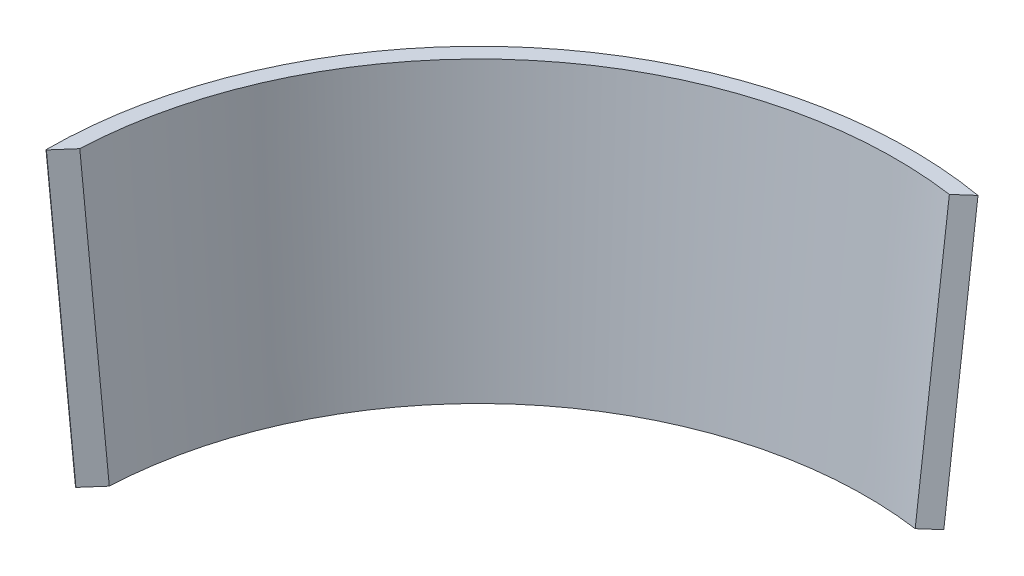
ISO-10303-21;
HEADER;
FILE_DESCRIPTION(('STEP AP214'),'2;1');
FILE_NAME('part.step','',(''),(''),'','','');
FILE_SCHEMA(('AUTOMOTIVE_DESIGN { 1 0 10303 214 1 1 1 1 }'));
ENDSEC;
DATA;
#1=APPLICATION_CONTEXT('core data for automotive mechanical design processes');
#2=APPLICATION_PROTOCOL_DEFINITION('international standard','automotive_design',2000,#1);
#3=PRODUCT_CONTEXT('',#1,'mechanical');
#4=PRODUCT('Part','Part','',(#3));
#5=PRODUCT_RELATED_PRODUCT_CATEGORY('part','',(#4));
#6=PRODUCT_DEFINITION_FORMATION('','',#4);
#7=PRODUCT_DEFINITION_CONTEXT('part definition',#1,'design');
#8=PRODUCT_DEFINITION('design','',#6,#7);
#9=PRODUCT_DEFINITION_SHAPE('','',#8);
#10=(LENGTH_UNIT() NAMED_UNIT(*) SI_UNIT(.MILLI.,.METRE.));
#11=(NAMED_UNIT(*) PLANE_ANGLE_UNIT() SI_UNIT($,.RADIAN.));
#12=(NAMED_UNIT(*) SI_UNIT($,.STERADIAN.) SOLID_ANGLE_UNIT());
#13=UNCERTAINTY_MEASURE_WITH_UNIT(LENGTH_MEASURE(1.E-05),#10,'distance_accuracy_value','');
#14=(GEOMETRIC_REPRESENTATION_CONTEXT(3) GLOBAL_UNCERTAINTY_ASSIGNED_CONTEXT((#13)) GLOBAL_UNIT_ASSIGNED_CONTEXT((#10,
#11,#12)) REPRESENTATION_CONTEXT('',''));
#15=CARTESIAN_POINT('',(0.,0.,0.));
#16=DIRECTION('',(0.,0.,1.));
#17=DIRECTION('',(1.,0.,0.));
#18=AXIS2_PLACEMENT_3D('',#15,#16,#17);
#19=CARTESIAN_POINT('',(4.84537136696433,17.899082056199,-27.4794665427604));
#20=DIRECTION('',(0.,-1.,0.));
#21=DIRECTION('',(0.,0.,-1.));
#22=AXIS2_PLACEMENT_3D('',#19,#20,#21);
#23=PLANE('',#22);
#24=CARTESIAN_POINT('',(0.,17.899082056199,0.));
#25=DIRECTION('',(0.,1.,0.));
#26=DIRECTION('',(0.,0.,1.));
#27=AXIS2_PLACEMENT_3D('',#24,#25,#26);
#28=CIRCLE('',#27,26.8977434448525);
#29=CARTESIAN_POINT('',(3.72453229053228,17.899082056199,-26.6386272476997));
#30=VERTEX_POINT('',#29);
#31=CARTESIAN_POINT('',(-26.873179757852,17.899082056199,-1.1492659079964));
#32=VERTEX_POINT('',#31);
#33=EDGE_CURVE('E158',#30,#32,#28,.T.);
#34=ORIENTED_EDGE('',*,*,#33,.F.);
#35=CARTESIAN_POINT('',(4.70718611804044,17.899082056199,-27.5034743988576));
#36=CARTESIAN_POINT('',(4.66624164030776,17.8990820561861,-27.4674392184072));
#37=CARTESIAN_POINT('',(4.62529720085945,17.8990820561748,-27.4314039944568));
#38=CARTESIAN_POINT('',(4.54340847332835,17.8990820561555,-27.3593335253606));
#39=CARTESIAN_POINT('',(4.50246418524542,17.8990820561474,-27.323298280215));
#40=CARTESIAN_POINT('',(4.42057576046812,17.8990820561346,-27.2512277687257));
#41=CARTESIAN_POINT('',(4.3796316237736,17.8990820561297,-27.2151925023821));
#42=CARTESIAN_POINT('',(4.29774350179618,17.8990820561233,-27.1431219484941));
#43=CARTESIAN_POINT('',(4.25679951651313,17.8990820561217,-27.1070866609498));
#44=CARTESIAN_POINT('',(4.17491169738169,17.8990820561217,-27.0350160646574));
#45=CARTESIAN_POINT('',(4.13396786353316,17.8990820561233,-26.9989807559095));
#46=CARTESIAN_POINT('',(4.05208034729382,17.8990820561297,-26.9269101172072));
#47=CARTESIAN_POINT('',(4.01113666490288,17.8990820561346,-26.8908747872529));
#48=CARTESIAN_POINT('',(3.92924945160176,17.8990820561474,-26.8188041061349));
#49=CARTESIAN_POINT('',(3.88830592069146,17.8990820561555,-26.7827687549714));
#50=CARTESIAN_POINT('',(3.80641901037471,17.8990820561748,-26.7106980314322));
#51=CARTESIAN_POINT('',(3.76547563096812,17.8990820561861,-26.6746626590566));
#52=CARTESIAN_POINT('',(3.72453228989319,17.899082056199,-26.6386272431288));
#53=B_SPLINE_CURVE_WITH_KNOTS('',3,(#35,#36,#37,#38,#39,#40,#41,#42,#43,#44,#45,#46,#47,#48,#49,
#50,#51,#52),.UNSPECIFIED.,.F.,.F.,(4,2,2,2,2,2,2,2,4),(0.,0.163630255093668,0.327260211317613,
0.490889868626257,0.654519226974008,0.818148286315267,0.981777046604444,1.14540550779591,
1.30903366984404),.UNSPECIFIED.);
#54=CARTESIAN_POINT('',(4.70718611804044,17.899082056199,-27.5034743988576));
#55=VERTEX_POINT('',#54);
#56=EDGE_CURVE('E53',#30,#55,#53,.F.);
#57=ORIENTED_EDGE('',*,*,#56,.T.);
#58=CARTESIAN_POINT('',(0.,17.899082056199,0.));
#59=DIRECTION('',(0.,1.,0.));
#60=DIRECTION('',(0.,0.,1.));
#61=AXIS2_PLACEMENT_3D('',#58,#59,#60);
#62=CIRCLE('',#61,27.9033816079429);
#63=CARTESIAN_POINT('',(-27.9033816079429,17.899082056199,0.));
#64=VERTEX_POINT('',#63);
#65=EDGE_CURVE('E114',#55,#64,#62,.T.);
#66=ORIENTED_EDGE('',*,*,#65,.T.);
#67=DIRECTION('',(1.,0.,0.));
#68=VECTOR('',#67,1.);
#69=CARTESIAN_POINT('',(-27.9033816079429,17.899082056199,0.));
#70=LINE('',#69,#68);
#71=CARTESIAN_POINT('',(-27.8779200826471,17.899082056199,0.));
#72=VERTEX_POINT('',#71);
#73=EDGE_CURVE('E104',#64,#72,#70,.T.);
#74=ORIENTED_EDGE('',*,*,#73,.T.);
#75=CARTESIAN_POINT('',(-26.8731797510033,17.899082056199,-1.14926590770351));
#76=CARTESIAN_POINT('',(-26.9150439469995,17.8990820561811,-1.10138048949174));
#77=CARTESIAN_POINT('',(-26.9569081009209,17.8990820561654,-1.05349503449565));
#78=CARTESIAN_POINT('',(-27.0406364163558,17.8990820561386,-0.957723946023309));
#79=CARTESIAN_POINT('',(-27.0825005778692,17.8990820561275,-0.909838312546903));
#80=CARTESIAN_POINT('',(-27.1662289084865,17.8990820561097,-0.814066867140752));
#81=CARTESIAN_POINT('',(-27.2080930775902,17.8990820561031,-0.766181055210845));
#82=CARTESIAN_POINT('',(-27.2918214233865,17.8990820560944,-0.670409252924502));
#83=CARTESIAN_POINT('',(-27.3336856000789,17.8990820560923,-0.622523262567906));
#84=CARTESIAN_POINT('',(-27.4174139610508,17.8990820560926,-0.526751103454984));
#85=CARTESIAN_POINT('',(-27.4592781453302,17.899082056095,-0.478864934698497));
#86=CARTESIAN_POINT('',(-27.5430065214743,17.8990820561043,-0.383092418812588));
#87=CARTESIAN_POINT('',(-27.5848707133388,17.8990820561112,-0.335206071683006));
#88=CARTESIAN_POINT('',(-27.6685991046517,17.8990820561296,-0.239433199077699));
#89=CARTESIAN_POINT('',(-27.7104633040998,17.8990820561411,-0.191546673601815));
#90=CARTESIAN_POINT('',(-27.794191710578,17.8990820561685,-0.0957734443306857));
#91=CARTESIAN_POINT('',(-27.836055917608,17.8990820561844,-0.0478867405352796));
#92=CARTESIAN_POINT('',(-27.8779200826126,17.8990820562026,0.));
#93=B_SPLINE_CURVE_WITH_KNOTS('',3,(#75,#76,#77,#78,#79,#80,#81,#82,#83,#84,#85,#86,#87,#88,#89,
#90,#91,#92),.UNSPECIFIED.,.F.,.F.,(4,2,2,2,2,2,2,2,4),(0.,0.190815664067568,0.381631746235359,
0.572448246440028,0.763265164618261,0.954082500706735,1.14490025464215,1.33571842636123,
1.52653701580071),.UNSPECIFIED.);
#94=EDGE_CURVE('E66',#72,#32,#93,.F.);
#95=ORIENTED_EDGE('',*,*,#94,.T.);
#96=EDGE_LOOP('',(#34,#57,#66,#74,#95));
#97=FACE_BOUND('',#96,.T.);
#98=ADVANCED_FACE('F39',(#97),#23,.F.);
#99=CARTESIAN_POINT('',(0.,17.899082056199,0.));
#100=DIRECTION('',(0.,1.,0.));
#101=DIRECTION('',(0.,0.,1.));
#102=AXIS2_PLACEMENT_3D('',#99,#100,#101);
#103=CONICAL_SURFACE('',#102,26.8977434448525,0.105941485596057);
#104=CARTESIAN_POINT('',(0.,0.,0.));
#105=DIRECTION('',(0.,1.,0.));
#106=DIRECTION('',(0.,0.,1.));
#107=AXIS2_PLACEMENT_3D('',#104,#105,#106);
#108=CIRCLE('',#107,24.9943618369096);
#109=CARTESIAN_POINT('',(3.39682969299118,0.,-24.7624649756679));
#110=VERTEX_POINT('',#109);
#111=CARTESIAN_POINT('',(-24.9680686929752,0.,-1.14615416817915));
#112=VERTEX_POINT('',#111);
#113=EDGE_CURVE('E113',#110,#112,#108,.T.);
#114=ORIENTED_EDGE('',*,*,#113,.F.);
#115=CARTESIAN_POINT('',(3.74335157404751,18.9263577583658,-26.7462984295043));
#116=CARTESIAN_POINT('',(3.62226977645123,12.3171498834082,-26.0535739582022));
#117=CARTESIAN_POINT('',(3.50125962708201,5.70794546619926,-25.3608080326683));
#118=CARTESIAN_POINT('',(3.38034010694819,-0.901254577957637,-24.6679901230087));
#119=B_SPLINE_CURVE_WITH_KNOTS('',3,(#115,#116,#117,#118),.UNSPECIFIED.,.F.,.F.,(4,4),
(0.0434701945984445,0.0634097500495366),.UNSPECIFIED.);
#120=EDGE_CURVE('E184',#110,#30,#119,.F.);
#121=ORIENTED_EDGE('',*,*,#120,.T.);
#122=ORIENTED_EDGE('',*,*,#33,.T.);
#123=CARTESIAN_POINT('',(-24.8722440262794,-0.90024050542209,-1.14598559109312));
#124=CARTESIAN_POINT('',(-25.57496058694,5.70152291926963,-1.14722636251729));
#125=CARTESIAN_POINT('',(-26.2776244726915,12.3032926882978,-1.14836690295811));
#126=CARTESIAN_POINT('',(-26.9802463439177,18.9050674632524,-1.14942825308782));
#127=B_SPLINE_CURVE_WITH_KNOTS('',3,(#123,#124,#125,#126),.UNSPECIFIED.,.F.,.F.,(4,4),
(0.0434525483074889,0.0633697404042006),.UNSPECIFIED.);
#128=EDGE_CURVE('E172',#32,#112,#127,.F.);
#129=ORIENTED_EDGE('',*,*,#128,.T.);
#130=EDGE_LOOP('',(#114,#121,#122,#129));
#131=FACE_BOUND('',#130,.T.);
#132=ADVANCED_FACE('F147',(#131),#103,.F.);
#133=CARTESIAN_POINT('',(4.34022538492732,0.,-24.614641318581));
#134=DIRECTION('',(0.,1.,0.));
#135=DIRECTION('',(0.,0.,1.));
#136=AXIS2_PLACEMENT_3D('',#133,#134,#135);
#137=PLANE('',#136);
#138=CARTESIAN_POINT('',(0.,0.,0.));
#139=DIRECTION('',(0.,1.,0.));
#140=DIRECTION('',(0.,0.,1.));
#141=AXIS2_PLACEMENT_3D('',#138,#139,#140);
#142=CIRCLE('',#141,26.);
#143=CARTESIAN_POINT('',(4.37809563757643,0.,-25.6287393093815));
#144=VERTEX_POINT('',#143);
#145=CARTESIAN_POINT('',(-26.,0.,0.));
#146=VERTEX_POINT('',#145);
#147=EDGE_CURVE('E97',#144,#146,#142,.T.);
#148=ORIENTED_EDGE('',*,*,#147,.F.);
#149=CARTESIAN_POINT('',(3.39682969240652,0.,-24.762464971248));
#150=CARTESIAN_POINT('',(3.43771511749954,-1.59650171812528E-11,-24.7985598695074));
#151=CARTESIAN_POINT('',(3.4786005868469,-2.99371431345583E-11,-24.8346547176389));
#152=CARTESIAN_POINT('',(3.5603717003712,-5.38891115324984E-11,-24.9068443898824));
#153=CARTESIAN_POINT('',(3.60125734454832,-6.38689455467657E-11,-24.9429392139942));
#154=CARTESIAN_POINT('',(3.68302880770352,-7.9834615380386E-11,-25.0151288382016));
#155=CARTESIAN_POINT('',(3.72391462668179,-8.58204427671701E-11,-25.0512236382971));
#156=CARTESIAN_POINT('',(3.80568643941066,-9.3800728705514E-11,-25.1234132144752));
#157=CARTESIAN_POINT('',(3.84657243316145,-9.57951788314734E-11,-25.1595079905577));
#158=CARTESIAN_POINT('',(3.92834459540678,-9.57925201047941E-11,-25.2316975187133));
#159=CARTESIAN_POINT('',(3.9692307639015,-9.37954028275712E-11,-25.2677922707862));
#160=CARTESIAN_POINT('',(4.05100327560607,-8.58104035599793E-11,-25.339981750926));
#161=CARTESIAN_POINT('',(4.09188961881611,-7.98225131481192E-11,-25.3760764789927));
#162=CARTESIAN_POINT('',(4.17366247992273,-6.38566466379259E-11,-25.4482659111235));
#163=CARTESIAN_POINT('',(4.2145489978195,-5.38786621209512E-11,-25.4843606151874));
#164=CARTESIAN_POINT('',(4.296322208271,-2.9933081453443E-11,-25.5565499993159));
#165=CARTESIAN_POINT('',(4.33720890082591,-1.59654768866838E-11,-25.5926446793803));
#166=CARTESIAN_POINT('',(4.37809563757643,0.,-25.6287393093815));
#167=B_SPLINE_CURVE_WITH_KNOTS('',3,(#149,#150,#151,#152,#153,#154,#155,#156,#157,#158,#159,
#160,#161,#162,#163,#164,#165,#166),.UNSPECIFIED.,.F.,.F.,(4,2,2,2,2,2,2,2,4),(0.,
0.163615821326882,0.327231988153092,0.490848500421959,0.654465358076842,0.818082561061091,
0.981700109318084,1.14531800279119,1.3089362414238),.UNSPECIFIED.);
#168=EDGE_CURVE('E236',#144,#110,#167,.F.);
#169=ORIENTED_EDGE('',*,*,#168,.T.);
#170=ORIENTED_EDGE('',*,*,#113,.T.);
#171=CARTESIAN_POINT('',(-25.9726726185495,4.17775623123839E-12,0.));
#172=CARTESIAN_POINT('',(-25.9308141368013,-1.83657509434156E-11,-0.0477571849521249));
#173=CARTESIAN_POINT('',(-25.8889556068124,-3.81179530922549E-11,-0.0955143276220432));
#174=CARTESIAN_POINT('',(-25.8052385562052,-7.20325943830765E-11,-0.191028407597595));
#175=CARTESIAN_POINT('',(-25.7633800355871,-8.61950476623859E-11,-0.238785344903443));
#176=CARTESIAN_POINT('',(-25.6796630037236,-1.08923123617121E-10,-0.334299014117719));
#177=CARTESIAN_POINT('',(-25.6378044924784,-1.17488760450125E-10,-0.382055746026361));
#178=CARTESIAN_POINT('',(-25.5540874793631,-1.29027519743823E-10,-0.477569004413083));
#179=CARTESIAN_POINT('',(-25.5122289774932,-1.32000656353553E-10,-0.525325530891377));
#180=CARTESIAN_POINT('',(-25.4285119831306,-1.32352525557702E-10,-0.620838378384255));
#181=CARTESIAN_POINT('',(-25.3866534906382,-1.29731272308314E-10,-0.668594699399054));
#182=CARTESIAN_POINT('',(-25.3029365150329,-1.18892650682063E-10,-0.764107135931787));
#183=CARTESIAN_POINT('',(-25.2610780319203,-1.106752964681E-10,-0.811863251449936));
#184=CARTESIAN_POINT('',(-25.1773610750768,-8.86486329776478E-11,-0.907375276956207));
#185=CARTESIAN_POINT('',(-25.1355026013462,-7.48393378559071E-11,-0.955131186944545));
#186=CARTESIAN_POINT('',(-25.0517856632691,-4.16218729716022E-11,-1.05064280135803));
#187=CARTESIAN_POINT('',(-25.0099271989229,-2.22137173836817E-11,-1.09839850578339));
#188=CARTESIAN_POINT('',(-24.9680686862748,0.,-1.14615416787157));
#189=B_SPLINE_CURVE_WITH_KNOTS('',3,(#171,#172,#173,#174,#175,#176,#177,#178,#179,#180,#181,
#182,#183,#184,#185,#186,#187,#188),.UNSPECIFIED.,.F.,.F.,(4,2,2,2,2,2,2,2,4),(0.,
0.190514909860992,0.381029337877637,0.571543283971474,0.762056748064029,0.952569730076807,
1.1430822299313,1.333594247549,1.52410578285136),.UNSPECIFIED.);
#190=CARTESIAN_POINT('',(-25.9726726186406,0.,0.));
#191=VERTEX_POINT('',#190);
#192=EDGE_CURVE('E100',#112,#191,#189,.F.);
#193=ORIENTED_EDGE('',*,*,#192,.T.);
#194=DIRECTION('',(-1.,0.,0.));
#195=VECTOR('',#194,1.);
#196=CARTESIAN_POINT('',(-24.9943618369096,0.,0.));
#197=LINE('',#196,#195);
#198=EDGE_CURVE('E94',#191,#146,#197,.T.);
#199=ORIENTED_EDGE('',*,*,#198,.T.);
#200=EDGE_LOOP('',(#148,#169,#170,#193,#199));
#201=FACE_BOUND('',#200,.T.);
#202=ADVANCED_FACE('F96',(#201),#137,.F.);
#203=CARTESIAN_POINT('',(0.,0.,0.));
#204=DIRECTION('',(0.,1.,0.));
#205=DIRECTION('',(0.,0.,1.));
#206=AXIS2_PLACEMENT_3D('',#203,#204,#205);
#207=CONICAL_SURFACE('',#206,26.,0.105941485596057);
#208=ORIENTED_EDGE('',*,*,#65,.F.);
#209=CARTESIAN_POINT('',(4.37809563757642,0.,-25.6287393093815));
#210=CARTESIAN_POINT('',(4.39180720640697,0.745794674039589,-25.7068572318697));
#211=CARTESIAN_POINT('',(4.40551884652127,1.4915894021336,-25.784974625786));
#212=CARTESIAN_POINT('',(4.43294226602127,2.98317896587032,-25.9412083817561));
#213=CARTESIAN_POINT('',(4.44665404540697,3.72897380151302,-26.01932474381));
#214=CARTESIAN_POINT('',(4.47407774011556,5.22056357771677,-26.1755564611201));
#215=CARTESIAN_POINT('',(4.48778965543846,5.96635851827782,-26.2536718163763));
#216=CARTESIAN_POINT('',(4.51521361864796,7.45794850168806,-26.4099015451597));
#217=CARTESIAN_POINT('',(4.52892566653458,8.20374354453724,-26.4880159186869));
#218=CARTESIAN_POINT('',(4.55634989146948,9.69533372989349,-26.6442437090839));
#219=CARTESIAN_POINT('',(4.57006206851777,10.4411288724006,-26.7223571259537));
#220=CARTESIAN_POINT('',(4.59748654834182,11.9327192544423,-26.8785830281106));
#221=CARTESIAN_POINT('',(4.61119885111759,12.678514493977,-26.9566955133978));
#222=CARTESIAN_POINT('',(4.63862357893386,14.1701050674438,-27.1129195774674));
#223=CARTESIAN_POINT('',(4.65233600397435,14.9159004013759,-27.1910311562497));
#224=CARTESIAN_POINT('',(4.67976097281802,16.4074911610072,-27.3472534323912));
#225=CARTESIAN_POINT('',(4.6934735166212,17.1532865867065,-27.4253641297504));
#226=CARTESIAN_POINT('',(4.70718611804043,17.899082056199,-27.5034743988576));
#227=B_SPLINE_CURVE_WITH_KNOTS('',3,(#209,#210,#211,#212,#213,#214,#215,#216,#217,#218,#219,
#220,#221,#222,#223,#224,#225,#226),.UNSPECIFIED.,.F.,.F.,(4,2,2,2,2,2,2,2,4),(0.,
2.25000022551873,4.50000045708954,6.75000069451903,9.00000093761278,11.2500011861754,
13.5000014400103,15.7500016989202,18.0000019627065),.UNSPECIFIED.);
#228=EDGE_CURVE('E111',#55,#144,#227,.F.);
#229=ORIENTED_EDGE('',*,*,#228,.T.);
#230=ORIENTED_EDGE('',*,*,#147,.T.);
#231=DIRECTION('',(-0.105743422663495,0.99439344756661,0.));
#232=VECTOR('',#231,1.);
#233=CARTESIAN_POINT('',(-26.,0.,0.));
#234=LINE('',#233,#232);
#235=EDGE_CURVE('E103',#146,#64,#234,.T.);
#236=ORIENTED_EDGE('',*,*,#235,.T.);
#237=EDGE_LOOP('',(#208,#229,#230,#236));
#238=FACE_BOUND('',#237,.T.);
#239=ADVANCED_FACE('F109',(#238),#207,.T.);
#240=CARTESIAN_POINT('',(0.,0.,0.));
#241=DIRECTION('',(0.,0.,-1.));
#242=DIRECTION('',(-1.,0.,0.));
#243=AXIS2_PLACEMENT_3D('',#240,#241,#242);
#244=PLANE('',#243);
#245=ORIENTED_EDGE('',*,*,#198,.F.);
#246=CARTESIAN_POINT('',(-27.9737386157543,18.7993240405889,0.));
#247=CARTESIAN_POINT('',(-27.2710715205349,12.1975492656343,0.));
#248=CARTESIAN_POINT('',(-26.5683573763933,5.59577949660614,0.));
#249=CARTESIAN_POINT('',(-25.8655836553097,-1.00598392808559,0.));
#250=B_SPLINE_CURVE_WITH_KNOTS('',3,(#246,#247,#248,#249),.UNSPECIFIED.,.F.,.F.,(4,4),
(0.0434525483074889,0.0633697404042006),.UNSPECIFIED.);
#251=EDGE_CURVE('E12',#191,#72,#250,.F.);
#252=ORIENTED_EDGE('',*,*,#251,.T.);
#253=ORIENTED_EDGE('',*,*,#73,.F.);
#254=ORIENTED_EDGE('',*,*,#235,.F.);
#255=EDGE_LOOP('',(#245,#252,#253,#254));
#256=FACE_BOUND('',#255,.T.);
#257=ADVANCED_FACE('F116',(#256),#244,.F.);
#258=CARTESIAN_POINT('',(4.89241835996468,18.8003376545134,-27.746283298831));
#259=CARTESIAN_POINT('',(4.77029797496603,12.1911297795558,-27.0537041795834));
#260=CARTESIAN_POINT('',(4.64817194625023,5.58192536234683,-26.3610930532254));
#261=CARTESIAN_POINT('',(4.52603878211393,-1.02727468181007,-25.6684414598868));
#262=CARTESIAN_POINT('',(3.74335157404751,18.9263577583658,-26.7462984295043));
#263=CARTESIAN_POINT('',(3.62226977645123,12.3171498834082,-26.0535739582022));
#264=CARTESIAN_POINT('',(3.50125962708201,5.70794546619926,-25.3608080326683));
#265=CARTESIAN_POINT('',(3.38034010694819,-0.901254577957637,-24.6679901230087));
#266=B_SPLINE_SURFACE_WITH_KNOTS('',1,3,((#258,#259,#260,#261),(#262,#263,#264,#265)),
.UNSPECIFIED.,.F.,.F.,.F.,(2,2),(4,4),(0.,1.),(0.0434701945984445,0.0634097500495366),.UNSPECIFIED.);
#267=ORIENTED_EDGE('',*,*,#56,.F.);
#268=ORIENTED_EDGE('',*,*,#120,.F.);
#269=ORIENTED_EDGE('',*,*,#168,.F.);
#270=ORIENTED_EDGE('',*,*,#228,.F.);
#271=EDGE_LOOP('',(#267,#268,#269,#270));
#272=FACE_BOUND('',#271,.T.);
#273=ADVANCED_FACE('F223',(#272),#266,.T.);
#274=CARTESIAN_POINT('',(-26.9802463439177,18.9050674632524,-1.14942825308782));
#275=CARTESIAN_POINT('',(-26.2776244726915,12.3032926882978,-1.14836690295811));
#276=CARTESIAN_POINT('',(-25.57496058694,5.70152291926963,-1.14722636251729));
#277=CARTESIAN_POINT('',(-24.8722440262794,-0.90024050542209,-1.14598559109312));
#278=CARTESIAN_POINT('',(-27.9737386157543,18.7993240405889,0.));
#279=CARTESIAN_POINT('',(-27.2710715205349,12.1975492656343,0.));
#280=CARTESIAN_POINT('',(-26.5683573763933,5.59577949660614,0.));
#281=CARTESIAN_POINT('',(-25.8655836553097,-1.00598392808559,0.));
#282=B_SPLINE_SURFACE_WITH_KNOTS('',1,3,((#274,#275,#276,#277),(#278,#279,#280,#281)),
.UNSPECIFIED.,.F.,.F.,.F.,(2,2),(4,4),(0.,1.),(0.0434525483074889,0.0633697404042006),.UNSPECIFIED.);
#283=ORIENTED_EDGE('',*,*,#94,.F.);
#284=ORIENTED_EDGE('',*,*,#251,.F.);
#285=ORIENTED_EDGE('',*,*,#192,.F.);
#286=ORIENTED_EDGE('',*,*,#128,.F.);
#287=EDGE_LOOP('',(#283,#284,#285,#286));
#288=FACE_BOUND('',#287,.T.);
#289=ADVANCED_FACE('F42',(#288),#282,.T.);
#290=CLOSED_SHELL('',(#98,#132,#202,#239,#257,#273,#289));
#291=MANIFOLD_SOLID_BREP('B2',#290);
#292=ADVANCED_BREP_SHAPE_REPRESENTATION('',(#18,#291),#14);
#293=SHAPE_DEFINITION_REPRESENTATION(#9,#292);
ENDSEC;
END-ISO-10303-21;
